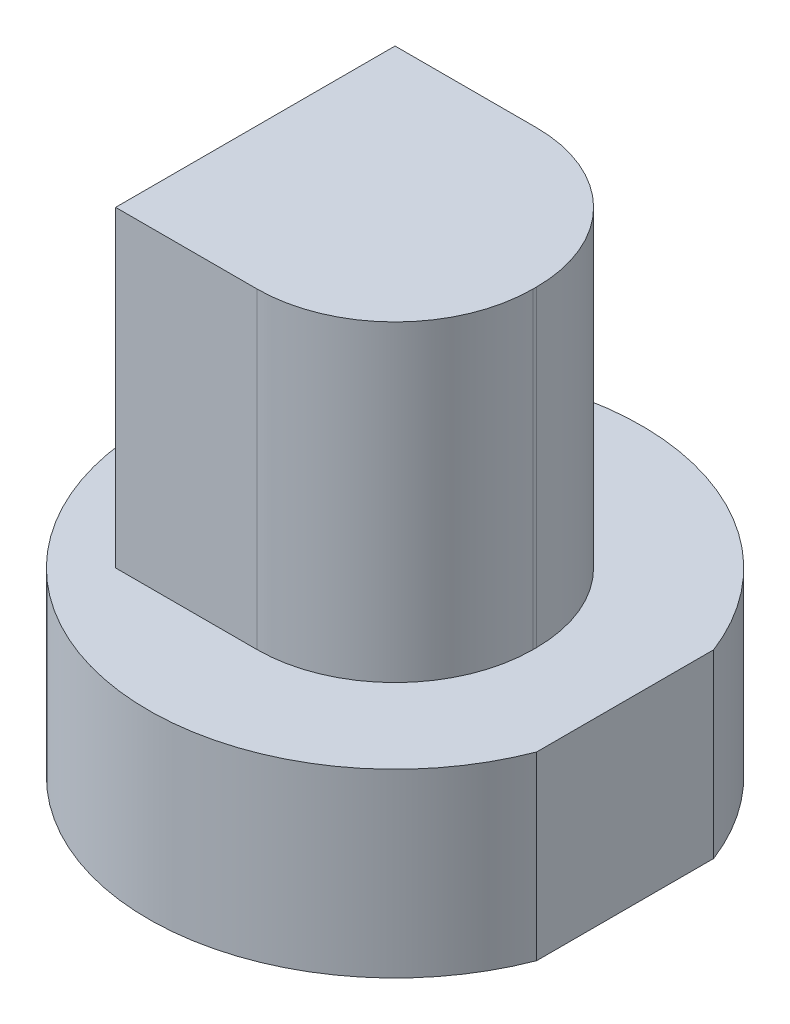
ISO-10303-21;
HEADER;
FILE_DESCRIPTION(('STEP AP214'),'2;1');
FILE_NAME('part.step','',(''),(''),'','','');
FILE_SCHEMA(('AUTOMOTIVE_DESIGN { 1 0 10303 214 1 1 1 1 }'));
ENDSEC;
DATA;
#1=APPLICATION_CONTEXT('core data for automotive mechanical design processes');
#2=APPLICATION_PROTOCOL_DEFINITION('international standard','automotive_design',2000,#1);
#3=PRODUCT_CONTEXT('',#1,'mechanical');
#4=PRODUCT('Part','Part','',(#3));
#5=PRODUCT_RELATED_PRODUCT_CATEGORY('part','',(#4));
#6=PRODUCT_DEFINITION_FORMATION('','',#4);
#7=PRODUCT_DEFINITION_CONTEXT('part definition',#1,'design');
#8=PRODUCT_DEFINITION('design','',#6,#7);
#9=PRODUCT_DEFINITION_SHAPE('','',#8);
#10=(LENGTH_UNIT() NAMED_UNIT(*) SI_UNIT(.MILLI.,.METRE.));
#11=(NAMED_UNIT(*) PLANE_ANGLE_UNIT() SI_UNIT($,.RADIAN.));
#12=(NAMED_UNIT(*) SI_UNIT($,.STERADIAN.) SOLID_ANGLE_UNIT());
#13=UNCERTAINTY_MEASURE_WITH_UNIT(LENGTH_MEASURE(1.E-05),#10,'distance_accuracy_value','');
#14=(GEOMETRIC_REPRESENTATION_CONTEXT(3) GLOBAL_UNCERTAINTY_ASSIGNED_CONTEXT((#13)) GLOBAL_UNIT_ASSIGNED_CONTEXT((#10,
#11,#12)) REPRESENTATION_CONTEXT('',''));
#15=CARTESIAN_POINT('',(0.,0.,0.));
#16=DIRECTION('',(0.,0.,1.));
#17=DIRECTION('',(1.,0.,0.));
#18=AXIS2_PLACEMENT_3D('',#15,#16,#17);
#19=CARTESIAN_POINT('',(0.,5.5,0.));
#20=DIRECTION('',(0.,1.,0.));
#21=DIRECTION('',(0.,0.,1.));
#22=AXIS2_PLACEMENT_3D('',#19,#20,#21);
#23=PLANE('',#22);
#24=CARTESIAN_POINT('',(0.,5.5,0.));
#25=DIRECTION('',(0.,1.,0.));
#26=DIRECTION('',(0.,0.,1.));
#27=AXIS2_PLACEMENT_3D('',#24,#25,#26);
#28=CIRCLE('',#27,7.5);
#29=CARTESIAN_POINT('',(7.,5.5,-2.69258240356725));
#30=VERTEX_POINT('',#29);
#31=CARTESIAN_POINT('',(7.,5.5,2.69258240356725));
#32=VERTEX_POINT('',#31);
#33=EDGE_CURVE('E77',#30,#32,#28,.T.);
#34=ORIENTED_EDGE('',*,*,#33,.T.);
#35=DIRECTION('',(0.,0.,-1.));
#36=VECTOR('',#35,1.);
#37=CARTESIAN_POINT('',(7.,5.5,-2.69258240356725));
#38=LINE('',#37,#36);
#39=EDGE_CURVE('E58',#32,#30,#38,.T.);
#40=ORIENTED_EDGE('',*,*,#39,.T.);
#41=EDGE_LOOP('',(#34,#40));
#42=FACE_BOUND('',#41,.T.);
#43=DIRECTION('',(1.,0.,0.));
#44=VECTOR('',#43,1.);
#45=CARTESIAN_POINT('',(-4.25,5.5,4.25));
#46=LINE('',#45,#44);
#47=CARTESIAN_POINT('',(-4.25,5.5,4.25));
#48=VERTEX_POINT('',#47);
#49=CARTESIAN_POINT('',(0.0499999999999702,5.5,4.25));
#50=VERTEX_POINT('',#49);
#51=EDGE_CURVE('E114',#48,#50,#46,.T.);
#52=ORIENTED_EDGE('',*,*,#51,.F.);
#53=DIRECTION('',(0.,0.,1.));
#54=VECTOR('',#53,1.);
#55=CARTESIAN_POINT('',(-4.25,5.5,4.25));
#56=LINE('',#55,#54);
#57=CARTESIAN_POINT('',(-4.25,5.5,-4.25));
#58=VERTEX_POINT('',#57);
#59=EDGE_CURVE('E117',#58,#48,#56,.T.);
#60=ORIENTED_EDGE('',*,*,#59,.F.);
#61=DIRECTION('',(-1.,0.,0.));
#62=VECTOR('',#61,1.);
#63=CARTESIAN_POINT('',(-4.25,5.5,-4.25));
#64=LINE('',#63,#62);
#65=CARTESIAN_POINT('',(0.0499999999999699,5.5,-4.25));
#66=VERTEX_POINT('',#65);
#67=EDGE_CURVE('E103',#66,#58,#64,.T.);
#68=ORIENTED_EDGE('',*,*,#67,.F.);
#69=CARTESIAN_POINT('',(0.0499999999999997,5.5,-0.0499999999999997));
#70=DIRECTION('',(0.,1.,0.));
#71=DIRECTION('',(0.,0.,-1.));
#72=AXIS2_PLACEMENT_3D('',#69,#70,#71);
#73=CIRCLE('',#72,4.2);
#74=CARTESIAN_POINT('',(4.25,5.5,-0.0499999999999702));
#75=VERTEX_POINT('',#74);
#76=EDGE_CURVE('E106',#75,#66,#73,.T.);
#77=ORIENTED_EDGE('',*,*,#76,.F.);
#78=DIRECTION('',(0.,0.,-1.));
#79=VECTOR('',#78,1.);
#80=CARTESIAN_POINT('',(4.25,5.5,0.0499999999999702));
#81=LINE('',#80,#79);
#82=CARTESIAN_POINT('',(4.25,5.5,0.0499999999999701));
#83=VERTEX_POINT('',#82);
#84=EDGE_CURVE('E108',#83,#75,#81,.T.);
#85=ORIENTED_EDGE('',*,*,#84,.F.);
#86=CARTESIAN_POINT('',(0.0499999999999997,5.5,0.0499999999999997));
#87=DIRECTION('',(0.,1.,0.));
#88=DIRECTION('',(0.,0.,1.));
#89=AXIS2_PLACEMENT_3D('',#86,#87,#88);
#90=CIRCLE('',#89,4.2);
#91=EDGE_CURVE('E111',#50,#83,#90,.T.);
#92=ORIENTED_EDGE('',*,*,#91,.F.);
#93=EDGE_LOOP('',(#52,#60,#68,#77,#85,#92));
#94=FACE_BOUND('',#93,.T.);
#95=ADVANCED_FACE('F35',(#42,#94),#23,.T.);
#96=CARTESIAN_POINT('',(0.,5.5,0.));
#97=DIRECTION('',(0.,-1.,0.));
#98=DIRECTION('',(0.,0.,-1.));
#99=AXIS2_PLACEMENT_3D('',#96,#97,#98);
#100=CYLINDRICAL_SURFACE('',#99,7.5);
#101=CARTESIAN_POINT('',(0.,0.,0.));
#102=DIRECTION('',(0.,1.,0.));
#103=DIRECTION('',(0.,0.,1.));
#104=AXIS2_PLACEMENT_3D('',#101,#102,#103);
#105=CIRCLE('',#104,7.5);
#106=CARTESIAN_POINT('',(7.,0.,-2.69258240356725));
#107=VERTEX_POINT('',#106);
#108=CARTESIAN_POINT('',(7.,0.,2.69258240356725));
#109=VERTEX_POINT('',#108);
#110=EDGE_CURVE('E78',#107,#109,#105,.T.);
#111=ORIENTED_EDGE('',*,*,#110,.T.);
#112=DIRECTION('',(0.,-1.,0.));
#113=VECTOR('',#112,1.);
#114=CARTESIAN_POINT('',(7.,5.5,2.69258240356725));
#115=LINE('',#114,#113);
#116=EDGE_CURVE('E11',#32,#109,#115,.T.);
#117=ORIENTED_EDGE('',*,*,#116,.F.);
#118=ORIENTED_EDGE('',*,*,#33,.F.);
#119=DIRECTION('',(0.,-1.,0.));
#120=VECTOR('',#119,1.);
#121=CARTESIAN_POINT('',(7.,5.5,-2.69258240356725));
#122=LINE('',#121,#120);
#123=EDGE_CURVE('E43',#30,#107,#122,.T.);
#124=ORIENTED_EDGE('',*,*,#123,.T.);
#125=EDGE_LOOP('',(#111,#117,#118,#124));
#126=FACE_BOUND('',#125,.T.);
#127=ADVANCED_FACE('F37',(#126),#100,.T.);
#128=CARTESIAN_POINT('',(7.,5.5,-2.69258240356725));
#129=DIRECTION('',(-1.,0.,0.));
#130=DIRECTION('',(0.,0.,1.));
#131=AXIS2_PLACEMENT_3D('',#128,#129,#130);
#132=PLANE('',#131);
#133=DIRECTION('',(0.,0.,-1.));
#134=VECTOR('',#133,1.);
#135=CARTESIAN_POINT('',(7.,0.,-2.69258240356725));
#136=LINE('',#135,#134);
#137=EDGE_CURVE('E69',#109,#107,#136,.T.);
#138=ORIENTED_EDGE('',*,*,#137,.T.);
#139=ORIENTED_EDGE('',*,*,#123,.F.);
#140=ORIENTED_EDGE('',*,*,#39,.F.);
#141=ORIENTED_EDGE('',*,*,#116,.T.);
#142=EDGE_LOOP('',(#138,#139,#140,#141));
#143=FACE_BOUND('',#142,.T.);
#144=ADVANCED_FACE('F71',(#143),#132,.F.);
#145=CARTESIAN_POINT('',(0.,0.,0.));
#146=DIRECTION('',(0.,1.,0.));
#147=DIRECTION('',(0.,0.,1.));
#148=AXIS2_PLACEMENT_3D('',#145,#146,#147);
#149=PLANE('',#148);
#150=CARTESIAN_POINT('',(0.,0.,0.));
#151=DIRECTION('',(0.,-1.,0.));
#152=DIRECTION('',(0.,0.,-1.));
#153=AXIS2_PLACEMENT_3D('',#150,#151,#152);
#154=CIRCLE('',#153,3.75);
#155=CARTESIAN_POINT('',(0.,0.,-3.75));
#156=VERTEX_POINT('',#155);
#157=EDGE_CURVE('E137',#156,#156,#154,.T.);
#158=ORIENTED_EDGE('',*,*,#157,.F.);
#159=EDGE_LOOP('',(#158));
#160=FACE_BOUND('',#159,.T.);
#161=ORIENTED_EDGE('',*,*,#110,.F.);
#162=ORIENTED_EDGE('',*,*,#137,.F.);
#163=EDGE_LOOP('',(#161,#162));
#164=FACE_BOUND('',#163,.T.);
#165=ADVANCED_FACE('F81',(#160,#164),#149,.F.);
#166=CARTESIAN_POINT('',(-4.25,15.,4.25));
#167=DIRECTION('',(1.,0.,0.));
#168=DIRECTION('',(0.,0.,-1.));
#169=AXIS2_PLACEMENT_3D('',#166,#167,#168);
#170=PLANE('',#169);
#171=ORIENTED_EDGE('',*,*,#59,.T.);
#172=DIRECTION('',(0.,-1.,0.));
#173=VECTOR('',#172,1.);
#174=CARTESIAN_POINT('',(-4.25,15.,4.25));
#175=LINE('',#174,#173);
#176=CARTESIAN_POINT('',(-4.25,15.,4.25));
#177=VERTEX_POINT('',#176);
#178=EDGE_CURVE('E82',#177,#48,#175,.T.);
#179=ORIENTED_EDGE('',*,*,#178,.F.);
#180=DIRECTION('',(0.,0.,1.));
#181=VECTOR('',#180,1.);
#182=CARTESIAN_POINT('',(-4.25,15.,4.25));
#183=LINE('',#182,#181);
#184=CARTESIAN_POINT('',(-4.25,15.,-4.25));
#185=VERTEX_POINT('',#184);
#186=EDGE_CURVE('E105',#185,#177,#183,.T.);
#187=ORIENTED_EDGE('',*,*,#186,.F.);
#188=DIRECTION('',(0.,-1.,0.));
#189=VECTOR('',#188,1.);
#190=CARTESIAN_POINT('',(-4.25,15.,-4.25));
#191=LINE('',#190,#189);
#192=EDGE_CURVE('E99',#185,#58,#191,.T.);
#193=ORIENTED_EDGE('',*,*,#192,.T.);
#194=EDGE_LOOP('',(#171,#179,#187,#193));
#195=FACE_BOUND('',#194,.T.);
#196=ADVANCED_FACE('F171',(#195),#170,.F.);
#197=CARTESIAN_POINT('',(-4.25,15.,4.25));
#198=DIRECTION('',(0.,0.,-1.));
#199=DIRECTION('',(-1.,0.,0.));
#200=AXIS2_PLACEMENT_3D('',#197,#198,#199);
#201=PLANE('',#200);
#202=ORIENTED_EDGE('',*,*,#51,.T.);
#203=DIRECTION('',(0.,-1.,0.));
#204=VECTOR('',#203,1.);
#205=CARTESIAN_POINT('',(0.0499999999999702,15.,4.25));
#206=LINE('',#205,#204);
#207=CARTESIAN_POINT('',(0.0499999999999702,15.,4.25));
#208=VERTEX_POINT('',#207);
#209=EDGE_CURVE('E85',#208,#50,#206,.T.);
#210=ORIENTED_EDGE('',*,*,#209,.F.);
#211=DIRECTION('',(1.,0.,0.));
#212=VECTOR('',#211,1.);
#213=CARTESIAN_POINT('',(-4.25,15.,4.25));
#214=LINE('',#213,#212);
#215=EDGE_CURVE('E132',#177,#208,#214,.T.);
#216=ORIENTED_EDGE('',*,*,#215,.F.);
#217=ORIENTED_EDGE('',*,*,#178,.T.);
#218=EDGE_LOOP('',(#202,#210,#216,#217));
#219=FACE_BOUND('',#218,.T.);
#220=ADVANCED_FACE('F177',(#219),#201,.F.);
#221=CARTESIAN_POINT('',(0.0499999999999997,15.,0.0499999999999997));
#222=DIRECTION('',(0.,-1.,0.));
#223=DIRECTION('',(0.,0.,-1.));
#224=AXIS2_PLACEMENT_3D('',#221,#222,#223);
#225=CYLINDRICAL_SURFACE('',#224,4.2);
#226=ORIENTED_EDGE('',*,*,#91,.T.);
#227=DIRECTION('',(0.,-1.,0.));
#228=VECTOR('',#227,1.);
#229=CARTESIAN_POINT('',(4.25,15.,0.0499999999999701));
#230=LINE('',#229,#228);
#231=CARTESIAN_POINT('',(4.25,15.,0.0499999999999701));
#232=VERTEX_POINT('',#231);
#233=EDGE_CURVE('E92',#232,#83,#230,.T.);
#234=ORIENTED_EDGE('',*,*,#233,.F.);
#235=CARTESIAN_POINT('',(0.0499999999999997,15.,0.0499999999999997));
#236=DIRECTION('',(0.,1.,0.));
#237=DIRECTION('',(0.,0.,1.));
#238=AXIS2_PLACEMENT_3D('',#235,#236,#237);
#239=CIRCLE('',#238,4.2);
#240=EDGE_CURVE('E129',#208,#232,#239,.T.);
#241=ORIENTED_EDGE('',*,*,#240,.F.);
#242=ORIENTED_EDGE('',*,*,#209,.T.);
#243=EDGE_LOOP('',(#226,#234,#241,#242));
#244=FACE_BOUND('',#243,.T.);
#245=ADVANCED_FACE('F189',(#244),#225,.T.);
#246=CARTESIAN_POINT('',(4.25,15.,0.0499999999999702));
#247=DIRECTION('',(-1.,0.,0.));
#248=DIRECTION('',(0.,0.,1.));
#249=AXIS2_PLACEMENT_3D('',#246,#247,#248);
#250=PLANE('',#249);
#251=ORIENTED_EDGE('',*,*,#84,.T.);
#252=DIRECTION('',(0.,-1.,0.));
#253=VECTOR('',#252,1.);
#254=CARTESIAN_POINT('',(4.25,15.,-0.0499999999999702));
#255=LINE('',#254,#253);
#256=CARTESIAN_POINT('',(4.25,15.,-0.0499999999999702));
#257=VERTEX_POINT('',#256);
#258=EDGE_CURVE('E95',#257,#75,#255,.T.);
#259=ORIENTED_EDGE('',*,*,#258,.F.);
#260=DIRECTION('',(0.,0.,-1.));
#261=VECTOR('',#260,1.);
#262=CARTESIAN_POINT('',(4.25,15.,0.0499999999999702));
#263=LINE('',#262,#261);
#264=EDGE_CURVE('E126',#232,#257,#263,.T.);
#265=ORIENTED_EDGE('',*,*,#264,.F.);
#266=ORIENTED_EDGE('',*,*,#233,.T.);
#267=EDGE_LOOP('',(#251,#259,#265,#266));
#268=FACE_BOUND('',#267,.T.);
#269=ADVANCED_FACE('F193',(#268),#250,.F.);
#270=CARTESIAN_POINT('',(0.0499999999999997,15.,-0.0499999999999997));
#271=DIRECTION('',(0.,-1.,0.));
#272=DIRECTION('',(0.,0.,-1.));
#273=AXIS2_PLACEMENT_3D('',#270,#271,#272);
#274=CYLINDRICAL_SURFACE('',#273,4.2);
#275=ORIENTED_EDGE('',*,*,#76,.T.);
#276=DIRECTION('',(0.,-1.,0.));
#277=VECTOR('',#276,1.);
#278=CARTESIAN_POINT('',(0.0499999999999699,15.,-4.25));
#279=LINE('',#278,#277);
#280=CARTESIAN_POINT('',(0.0499999999999699,15.,-4.25));
#281=VERTEX_POINT('',#280);
#282=EDGE_CURVE('E50',#281,#66,#279,.T.);
#283=ORIENTED_EDGE('',*,*,#282,.F.);
#284=CARTESIAN_POINT('',(0.0499999999999997,15.,-0.0499999999999997));
#285=DIRECTION('',(0.,1.,0.));
#286=DIRECTION('',(0.,0.,-1.));
#287=AXIS2_PLACEMENT_3D('',#284,#285,#286);
#288=CIRCLE('',#287,4.2);
#289=EDGE_CURVE('E123',#257,#281,#288,.T.);
#290=ORIENTED_EDGE('',*,*,#289,.F.);
#291=ORIENTED_EDGE('',*,*,#258,.T.);
#292=EDGE_LOOP('',(#275,#283,#290,#291));
#293=FACE_BOUND('',#292,.T.);
#294=ADVANCED_FACE('F197',(#293),#274,.T.);
#295=CARTESIAN_POINT('',(-4.25,15.,-4.25));
#296=DIRECTION('',(0.,0.,1.));
#297=DIRECTION('',(1.,0.,0.));
#298=AXIS2_PLACEMENT_3D('',#295,#296,#297);
#299=PLANE('',#298);
#300=ORIENTED_EDGE('',*,*,#67,.T.);
#301=ORIENTED_EDGE('',*,*,#192,.F.);
#302=DIRECTION('',(-1.,0.,0.));
#303=VECTOR('',#302,1.);
#304=CARTESIAN_POINT('',(-4.25,15.,-4.25));
#305=LINE('',#304,#303);
#306=EDGE_CURVE('E102',#281,#185,#305,.T.);
#307=ORIENTED_EDGE('',*,*,#306,.F.);
#308=ORIENTED_EDGE('',*,*,#282,.T.);
#309=EDGE_LOOP('',(#300,#301,#307,#308));
#310=FACE_BOUND('',#309,.T.);
#311=ADVANCED_FACE('F201',(#310),#299,.F.);
#312=CARTESIAN_POINT('',(0.0499999999999997,15.,-0.0499999999999997));
#313=DIRECTION('',(0.,-1.,0.));
#314=DIRECTION('',(0.,0.,-1.));
#315=AXIS2_PLACEMENT_3D('',#312,#313,#314);
#316=PLANE('',#315);
#317=ORIENTED_EDGE('',*,*,#186,.T.);
#318=ORIENTED_EDGE('',*,*,#215,.T.);
#319=ORIENTED_EDGE('',*,*,#240,.T.);
#320=ORIENTED_EDGE('',*,*,#264,.T.);
#321=ORIENTED_EDGE('',*,*,#289,.T.);
#322=ORIENTED_EDGE('',*,*,#306,.T.);
#323=EDGE_LOOP('',(#317,#318,#319,#320,#321,#322));
#324=FACE_BOUND('',#323,.T.);
#325=ADVANCED_FACE('F166',(#324),#316,.F.);
#326=CARTESIAN_POINT('',(0.,1.2,0.));
#327=DIRECTION('',(0.,-1.,0.));
#328=DIRECTION('',(0.,0.,-1.));
#329=AXIS2_PLACEMENT_3D('',#326,#327,#328);
#330=CYLINDRICAL_SURFACE('',#329,3.75);
#331=CARTESIAN_POINT('',(0.,1.2,0.));
#332=DIRECTION('',(0.,-1.,0.));
#333=DIRECTION('',(0.,0.,-1.));
#334=AXIS2_PLACEMENT_3D('',#331,#332,#333);
#335=CIRCLE('',#334,3.75);
#336=CARTESIAN_POINT('',(0.,1.2,-3.75));
#337=VERTEX_POINT('',#336);
#338=EDGE_CURVE('E120',#337,#337,#335,.T.);
#339=ORIENTED_EDGE('',*,*,#338,.F.);
#340=EDGE_LOOP('',(#339));
#341=FACE_BOUND('',#340,.T.);
#342=ORIENTED_EDGE('',*,*,#157,.T.);
#343=EDGE_LOOP('',(#342));
#344=FACE_BOUND('',#343,.T.);
#345=ADVANCED_FACE('F160',(#341,#344),#330,.F.);
#346=CARTESIAN_POINT('',(0.,1.2,0.));
#347=DIRECTION('',(0.,-1.,0.));
#348=DIRECTION('',(0.,0.,-1.));
#349=AXIS2_PLACEMENT_3D('',#346,#347,#348);
#350=PLANE('',#349);
#351=CARTESIAN_POINT('',(0.,1.2,0.));
#352=DIRECTION('',(0.,-1.,0.));
#353=DIRECTION('',(0.,0.,-1.));
#354=AXIS2_PLACEMENT_3D('',#351,#352,#353);
#355=CIRCLE('',#354,2.75);
#356=CARTESIAN_POINT('',(0.,1.2,-2.75));
#357=VERTEX_POINT('',#356);
#358=EDGE_CURVE('E143',#357,#357,#355,.T.);
#359=ORIENTED_EDGE('',*,*,#358,.F.);
#360=EDGE_LOOP('',(#359));
#361=FACE_BOUND('',#360,.T.);
#362=ORIENTED_EDGE('',*,*,#338,.T.);
#363=EDGE_LOOP('',(#362));
#364=FACE_BOUND('',#363,.T.);
#365=ADVANCED_FACE('F154',(#361,#364),#350,.T.);
#366=CARTESIAN_POINT('',(0.,14.2,0.));
#367=DIRECTION('',(0.,-1.,0.));
#368=DIRECTION('',(0.,0.,-1.));
#369=AXIS2_PLACEMENT_3D('',#366,#367,#368);
#370=CYLINDRICAL_SURFACE('',#369,2.75);
#371=CARTESIAN_POINT('',(0.,14.2,0.));
#372=DIRECTION('',(0.,-1.,0.));
#373=DIRECTION('',(0.,0.,-1.));
#374=AXIS2_PLACEMENT_3D('',#371,#372,#373);
#375=CIRCLE('',#374,2.75);
#376=CARTESIAN_POINT('',(0.,14.2,-2.75));
#377=VERTEX_POINT('',#376);
#378=EDGE_CURVE('E140',#377,#377,#375,.T.);
#379=CARTESIAN_POINT('',(0.,14.2,-2.75));
#380=CARTESIAN_POINT('',(0.,14.0645833333333,-2.75));
#381=CARTESIAN_POINT('',(0.,13.9291666666667,-2.75));
#382=CARTESIAN_POINT('',(0.,13.6583333333333,-2.75));
#383=CARTESIAN_POINT('',(0.,13.5229166666667,-2.75));
#384=CARTESIAN_POINT('',(0.,13.2520833333333,-2.75));
#385=CARTESIAN_POINT('',(0.,13.1166666666667,-2.75));
#386=CARTESIAN_POINT('',(0.,12.8458333333333,-2.75));
#387=CARTESIAN_POINT('',(0.,12.7104166666667,-2.75));
#388=CARTESIAN_POINT('',(0.,12.4395833333333,-2.75));
#389=CARTESIAN_POINT('',(0.,12.3041666666667,-2.75));
#390=CARTESIAN_POINT('',(0.,12.0333333333333,-2.75));
#391=CARTESIAN_POINT('',(0.,11.8979166666667,-2.75));
#392=CARTESIAN_POINT('',(0.,11.6270833333333,-2.75));
#393=CARTESIAN_POINT('',(0.,11.4916666666667,-2.75));
#394=CARTESIAN_POINT('',(0.,11.2208333333333,-2.75));
#395=CARTESIAN_POINT('',(0.,11.0854166666667,-2.75));
#396=CARTESIAN_POINT('',(0.,10.8145833333333,-2.75));
#397=CARTESIAN_POINT('',(0.,10.6791666666667,-2.75));
#398=CARTESIAN_POINT('',(0.,10.4083333333333,-2.75));
#399=CARTESIAN_POINT('',(0.,10.2729166666667,-2.75));
#400=CARTESIAN_POINT('',(0.,10.0020833333333,-2.75));
#401=CARTESIAN_POINT('',(0.,9.86666666666667,-2.75));
#402=CARTESIAN_POINT('',(0.,9.59583333333333,-2.75));
#403=CARTESIAN_POINT('',(0.,9.46041666666667,-2.75));
#404=CARTESIAN_POINT('',(0.,9.18958333333333,-2.75));
#405=CARTESIAN_POINT('',(0.,9.05416666666667,-2.75));
#406=CARTESIAN_POINT('',(0.,8.78333333333333,-2.75));
#407=CARTESIAN_POINT('',(0.,8.64791666666667,-2.75));
#408=CARTESIAN_POINT('',(0.,8.37708333333333,-2.75));
#409=CARTESIAN_POINT('',(0.,8.24166666666667,-2.75));
#410=CARTESIAN_POINT('',(0.,7.97083333333333,-2.75));
#411=CARTESIAN_POINT('',(0.,7.83541666666667,-2.75));
#412=CARTESIAN_POINT('',(0.,7.56458333333333,-2.75));
#413=CARTESIAN_POINT('',(0.,7.42916666666667,-2.75));
#414=CARTESIAN_POINT('',(0.,7.15833333333333,-2.75));
#415=CARTESIAN_POINT('',(0.,7.02291666666667,-2.75));
#416=CARTESIAN_POINT('',(0.,6.75208333333333,-2.75));
#417=CARTESIAN_POINT('',(0.,6.61666666666667,-2.75));
#418=CARTESIAN_POINT('',(0.,6.34583333333333,-2.75));
#419=CARTESIAN_POINT('',(0.,6.21041666666667,-2.75));
#420=CARTESIAN_POINT('',(0.,5.93958333333333,-2.75));
#421=CARTESIAN_POINT('',(0.,5.80416666666667,-2.75));
#422=CARTESIAN_POINT('',(0.,5.53333333333333,-2.75));
#423=CARTESIAN_POINT('',(0.,5.39791666666667,-2.75));
#424=CARTESIAN_POINT('',(0.,5.12708333333333,-2.75));
#425=CARTESIAN_POINT('',(0.,4.99166666666667,-2.75));
#426=CARTESIAN_POINT('',(0.,4.72083333333333,-2.75));
#427=CARTESIAN_POINT('',(0.,4.58541666666667,-2.75));
#428=CARTESIAN_POINT('',(0.,4.31458333333333,-2.75));
#429=CARTESIAN_POINT('',(0.,4.17916666666667,-2.75));
#430=CARTESIAN_POINT('',(0.,3.90833333333333,-2.75));
#431=CARTESIAN_POINT('',(0.,3.77291666666667,-2.75));
#432=CARTESIAN_POINT('',(0.,3.50208333333333,-2.75));
#433=CARTESIAN_POINT('',(0.,3.36666666666667,-2.75));
#434=CARTESIAN_POINT('',(0.,3.09583333333333,-2.75));
#435=CARTESIAN_POINT('',(0.,2.96041666666667,-2.75));
#436=CARTESIAN_POINT('',(0.,2.68958333333333,-2.75));
#437=CARTESIAN_POINT('',(0.,2.55416666666667,-2.75));
#438=CARTESIAN_POINT('',(0.,2.28333333333333,-2.75));
#439=CARTESIAN_POINT('',(0.,2.14791666666667,-2.75));
#440=CARTESIAN_POINT('',(0.,1.87708333333333,-2.75));
#441=CARTESIAN_POINT('',(0.,1.74166666666667,-2.75));
#442=CARTESIAN_POINT('',(0.,1.47083333333333,-2.75));
#443=CARTESIAN_POINT('',(0.,1.33541666666667,-2.75));
#444=CARTESIAN_POINT('',(0.,1.2,-2.75));
#445=B_SPLINE_CURVE_WITH_KNOTS('',3,(#379,#380,#381,#382,#383,#384,#385,#386,#387,#388,#389,
#390,#391,#392,#393,#394,#395,#396,#397,#398,#399,#400,#401,#402,#403,#404,#405,#406,#407,#408,
#409,#410,#411,#412,#413,#414,#415,#416,#417,#418,#419,#420,#421,#422,#423,#424,#425,#426,#427,
#428,#429,#430,#431,#432,#433,#434,#435,#436,#437,#438,#439,#440,#441,#442,#443,#444),
.UNSPECIFIED.,.F.,.F.,(4,2,2,2,2,2,2,2,2,2,2,2,2,2,2,2,2,2,2,2,2,2,2,2,2,2,2,2,2,2,2,2,4),(0.,
0.406249999999999,0.812499999999999,1.21875,1.625,2.03125,2.4375,2.84375,3.25,3.65625,4.0625,
4.46875,4.875,5.28125,5.6875,6.09375,6.5,6.90625,7.3125,7.71875,8.125,8.53125,8.9375,9.34375,
9.75,10.15625,10.5625,10.96875,11.375,11.78125,12.1875,12.59375,13.),.UNSPECIFIED.);
#446=EDGE_CURVE('BSEAM151',#377,#357,#445,.T.);
#447=ORIENTED_EDGE('',*,*,#378,.F.);
#448=ORIENTED_EDGE('',*,*,#358,.T.);
#449=ORIENTED_EDGE('',*,*,#446,.T.);
#450=ORIENTED_EDGE('',*,*,#446,.F.);
#451=EDGE_LOOP('',(#447,#449,#448,#450));
#452=FACE_BOUND('',#451,.T.);
#453=ADVANCED_FACE('F151',(#452),#370,.F.);
#454=CARTESIAN_POINT('',(0.,14.2,0.));
#455=DIRECTION('',(0.,-1.,0.));
#456=DIRECTION('',(0.,0.,-1.));
#457=AXIS2_PLACEMENT_3D('',#454,#455,#456);
#458=PLANE('',#457);
#459=ORIENTED_EDGE('',*,*,#378,.T.);
#460=EDGE_LOOP('',(#459));
#461=FACE_BOUND('',#460,.T.);
#462=ADVANCED_FACE('F149',(#461),#458,.T.);
#463=CLOSED_SHELL('',(#95,#127,#144,#165,#196,#220,#245,#269,#294,#311,#325,#345,#365,#453,#462));
#464=MANIFOLD_SOLID_BREP('B2',#463);
#465=ADVANCED_BREP_SHAPE_REPRESENTATION('',(#18,#464),#14);
#466=SHAPE_DEFINITION_REPRESENTATION(#9,#465);
ENDSEC;
END-ISO-10303-21;
